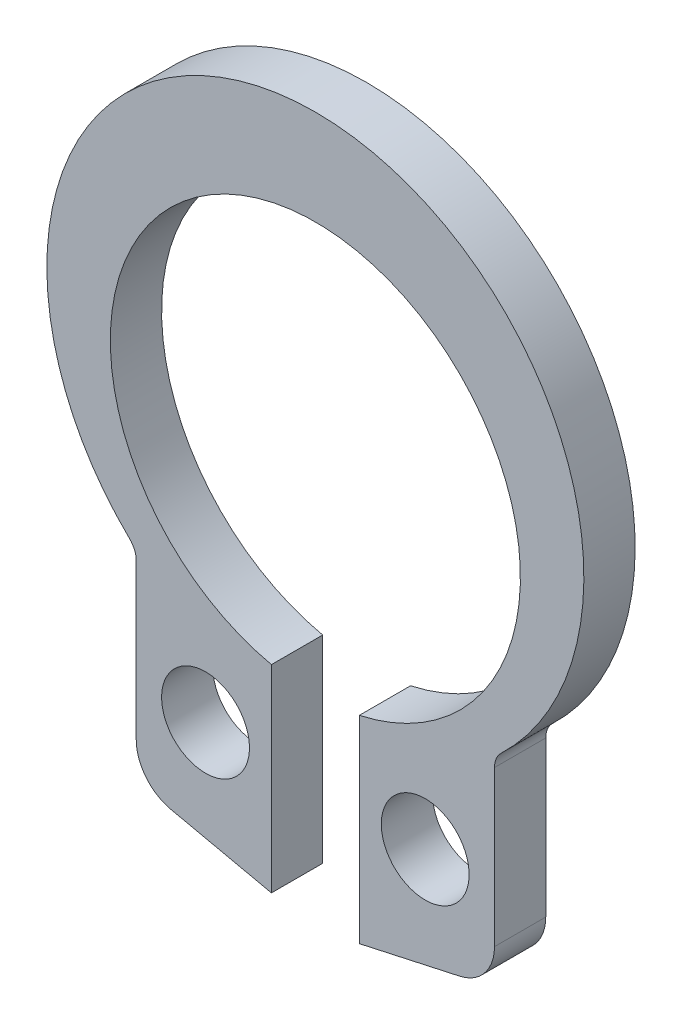
ISO-10303-21;
HEADER;
FILE_DESCRIPTION(('STEP AP214'),'2;1');
FILE_NAME('part.step','',(''),(''),'','','');
FILE_SCHEMA(('AUTOMOTIVE_DESIGN { 1 0 10303 214 1 1 1 1 }'));
ENDSEC;
DATA;
#1=APPLICATION_CONTEXT('core data for automotive mechanical design processes');
#2=APPLICATION_PROTOCOL_DEFINITION('international standard','automotive_design',2000,#1);
#3=PRODUCT_CONTEXT('',#1,'mechanical');
#4=PRODUCT('Part','Part','',(#3));
#5=PRODUCT_RELATED_PRODUCT_CATEGORY('part','',(#4));
#6=PRODUCT_DEFINITION_FORMATION('','',#4);
#7=PRODUCT_DEFINITION_CONTEXT('part definition',#1,'design');
#8=PRODUCT_DEFINITION('design','',#6,#7);
#9=PRODUCT_DEFINITION_SHAPE('','',#8);
#10=(LENGTH_UNIT() NAMED_UNIT(*) SI_UNIT(.MILLI.,.METRE.));
#11=(NAMED_UNIT(*) PLANE_ANGLE_UNIT() SI_UNIT($,.RADIAN.));
#12=(NAMED_UNIT(*) SI_UNIT($,.STERADIAN.) SOLID_ANGLE_UNIT());
#13=UNCERTAINTY_MEASURE_WITH_UNIT(LENGTH_MEASURE(1.E-05),#10,'distance_accuracy_value','');
#14=(GEOMETRIC_REPRESENTATION_CONTEXT(3) GLOBAL_UNCERTAINTY_ASSIGNED_CONTEXT((#13)) GLOBAL_UNIT_ASSIGNED_CONTEXT((#10,
#11,#12)) REPRESENTATION_CONTEXT('',''));
#15=CARTESIAN_POINT('',(0.,0.,0.));
#16=DIRECTION('',(0.,0.,1.));
#17=DIRECTION('',(1.,0.,0.));
#18=AXIS2_PLACEMENT_3D('',#15,#16,#17);
#19=CARTESIAN_POINT('',(1.84609723470894,-4.54731906631156,-0.35));
#20=DIRECTION('',(0.,0.,1.));
#21=DIRECTION('',(1.,0.,0.));
#22=AXIS2_PLACEMENT_3D('',#19,#20,#21);
#23=CYLINDRICAL_SURFACE('',#22,0.6);
#24=CARTESIAN_POINT('',(1.84609723470894,-4.54731906631156,-0.35));
#25=DIRECTION('',(0.,0.,-1.));
#26=DIRECTION('',(-1.,0.,0.));
#27=AXIS2_PLACEMENT_3D('',#24,#25,#26);
#28=CIRCLE('',#27,0.6);
#29=CARTESIAN_POINT('',(2.44609723470894,-4.54731906631156,-0.35));
#30=VERTEX_POINT('',#29);
#31=CARTESIAN_POINT('',(1.97466866328037,-5.13338168050488,-0.35));
#32=VERTEX_POINT('',#31);
#33=EDGE_CURVE('E262',#30,#32,#28,.T.);
#34=ORIENTED_EDGE('',*,*,#33,.F.);
#35=DIRECTION('',(0.,0.,-1.));
#36=VECTOR('',#35,1.);
#37=CARTESIAN_POINT('',(2.44609723470894,-4.54731906631156,-0.35));
#38=LINE('',#37,#36);
#39=CARTESIAN_POINT('',(2.44609723470894,-4.54731906631156,0.35));
#40=VERTEX_POINT('',#39);
#41=EDGE_CURVE('E114',#40,#30,#38,.T.);
#42=ORIENTED_EDGE('',*,*,#41,.F.);
#43=CARTESIAN_POINT('',(1.84609723470894,-4.54731906631156,0.35));
#44=DIRECTION('',(0.,0.,1.));
#45=DIRECTION('',(-1.,0.,0.));
#46=AXIS2_PLACEMENT_3D('',#43,#44,#45);
#47=CIRCLE('',#46,0.6);
#48=CARTESIAN_POINT('',(1.97466866328037,-5.13338168050488,0.35));
#49=VERTEX_POINT('',#48);
#50=EDGE_CURVE('E211',#49,#40,#47,.T.);
#51=ORIENTED_EDGE('',*,*,#50,.F.);
#52=DIRECTION('',(0.,0.,1.));
#53=VECTOR('',#52,1.);
#54=CARTESIAN_POINT('',(1.97466866328037,-5.13338168050488,-0.35));
#55=LINE('',#54,#53);
#56=EDGE_CURVE('E10',#32,#49,#55,.T.);
#57=ORIENTED_EDGE('',*,*,#56,.F.);
#58=EDGE_LOOP('',(#34,#42,#51,#57));
#59=FACE_BOUND('',#58,.T.);
#60=ADVANCED_FACE('F15',(#59),#23,.T.);
#61=CARTESIAN_POINT('',(2.74609723470894,-2.42907726299423,0.35));
#62=DIRECTION('',(0.,0.,-1.));
#63=DIRECTION('',(-1.,0.,0.));
#64=AXIS2_PLACEMENT_3D('',#61,#62,#63);
#65=CYLINDRICAL_SURFACE('',#64,0.3);
#66=CARTESIAN_POINT('',(2.74609723470894,-2.42907726299423,-0.35));
#67=DIRECTION('',(0.,0.,1.));
#68=DIRECTION('',(-1.,0.,0.));
#69=AXIS2_PLACEMENT_3D('',#66,#67,#68);
#70=CIRCLE('',#69,0.3);
#71=CARTESIAN_POINT('',(2.53840920855448,-2.21259242797786,-0.35));
#72=VERTEX_POINT('',#71);
#73=CARTESIAN_POINT('',(2.44609723470894,-2.42907726299423,-0.35));
#74=VERTEX_POINT('',#73);
#75=EDGE_CURVE('E224',#72,#74,#70,.T.);
#76=ORIENTED_EDGE('',*,*,#75,.F.);
#77=DIRECTION('',(0.,0.,-1.));
#78=VECTOR('',#77,1.);
#79=CARTESIAN_POINT('',(2.53840920855448,-2.21259242797786,0.35));
#80=LINE('',#79,#78);
#81=CARTESIAN_POINT('',(2.53840920855448,-2.21259242797786,0.35));
#82=VERTEX_POINT('',#81);
#83=EDGE_CURVE('E222',#82,#72,#80,.T.);
#84=ORIENTED_EDGE('',*,*,#83,.F.);
#85=CARTESIAN_POINT('',(2.74609723470894,-2.42907726299423,0.35));
#86=DIRECTION('',(0.,0.,-1.));
#87=DIRECTION('',(-1.,0.,0.));
#88=AXIS2_PLACEMENT_3D('',#85,#86,#87);
#89=CIRCLE('',#88,0.3);
#90=CARTESIAN_POINT('',(2.44609723470894,-2.42907726299423,0.35));
#91=VERTEX_POINT('',#90);
#92=EDGE_CURVE('E246',#91,#82,#89,.T.);
#93=ORIENTED_EDGE('',*,*,#92,.F.);
#94=DIRECTION('',(0.,0.,1.));
#95=VECTOR('',#94,1.);
#96=CARTESIAN_POINT('',(2.44609723470894,-2.42907726299423,-0.35));
#97=LINE('',#96,#95);
#98=EDGE_CURVE('E26',#74,#91,#97,.T.);
#99=ORIENTED_EDGE('',*,*,#98,.F.);
#100=EDGE_LOOP('',(#76,#84,#93,#99));
#101=FACE_BOUND('',#100,.T.);
#102=ADVANCED_FACE('F349',(#101),#65,.F.);
#103=CARTESIAN_POINT('',(1.5,-3.86943148278917,2.5));
#104=DIRECTION('',(0.,0.,-1.));
#105=DIRECTION('',(-1.,0.,0.));
#106=AXIS2_PLACEMENT_3D('',#103,#104,#105);
#107=CYLINDRICAL_SURFACE('',#106,0.6);
#108=CARTESIAN_POINT('',(1.5,-3.86943148278917,0.35));
#109=DIRECTION('',(0.,0.,-1.));
#110=DIRECTION('',(-1.,0.,0.));
#111=AXIS2_PLACEMENT_3D('',#108,#109,#110);
#112=CIRCLE('',#111,0.6);
#113=CARTESIAN_POINT('',(0.9,-3.86943148278917,0.35));
#114=VERTEX_POINT('',#113);
#115=EDGE_CURVE('E179',#114,#114,#112,.T.);
#116=ORIENTED_EDGE('',*,*,#115,.F.);
#117=EDGE_LOOP('',(#116));
#118=FACE_BOUND('',#117,.T.);
#119=CARTESIAN_POINT('',(1.5,-3.86943148278917,-0.35));
#120=DIRECTION('',(0.,0.,-1.));
#121=DIRECTION('',(-1.,0.,0.));
#122=AXIS2_PLACEMENT_3D('',#119,#120,#121);
#123=CIRCLE('',#122,0.6);
#124=CARTESIAN_POINT('',(0.9,-3.86943148278917,-0.35));
#125=VERTEX_POINT('',#124);
#126=EDGE_CURVE('E255',#125,#125,#123,.T.);
#127=ORIENTED_EDGE('',*,*,#126,.T.);
#128=EDGE_LOOP('',(#127));
#129=FACE_BOUND('',#128,.T.);
#130=ADVANCED_FACE('F354',(#118,#129),#107,.F.);
#131=CARTESIAN_POINT('',(2.44609723470894,-5.02995886623547,-0.35));
#132=DIRECTION('',(-0.214285714285713,0.976771023655525,0.));
#133=DIRECTION('',(0.,0.,1.));
#134=AXIS2_PLACEMENT_3D('',#131,#132,#133);
#135=PLANE('',#134);
#136=DIRECTION('',(-0.976771023655525,-0.214285714285713,0.));
#137=VECTOR('',#136,1.);
#138=CARTESIAN_POINT('',(2.44609723470894,-5.02995886623547,-0.35));
#139=LINE('',#138,#137);
#140=CARTESIAN_POINT('',(0.6,-5.43495886623547,-0.35));
#141=VERTEX_POINT('',#140);
#142=EDGE_CURVE('E167',#32,#141,#139,.T.);
#143=ORIENTED_EDGE('',*,*,#142,.F.);
#144=ORIENTED_EDGE('',*,*,#56,.T.);
#145=DIRECTION('',(-0.976771023655525,-0.214285714285713,0.));
#146=VECTOR('',#145,1.);
#147=CARTESIAN_POINT('',(2.44609723470894,-5.02995886623547,0.35));
#148=LINE('',#147,#146);
#149=CARTESIAN_POINT('',(0.6,-5.43495886623547,0.35));
#150=VERTEX_POINT('',#149);
#151=EDGE_CURVE('E216',#49,#150,#148,.T.);
#152=ORIENTED_EDGE('',*,*,#151,.T.);
#153=DIRECTION('',(0.,0.,1.));
#154=VECTOR('',#153,1.);
#155=CARTESIAN_POINT('',(0.6,-5.43495886623547,-0.35));
#156=LINE('',#155,#154);
#157=EDGE_CURVE('E124',#141,#150,#156,.T.);
#158=ORIENTED_EDGE('',*,*,#157,.F.);
#159=EDGE_LOOP('',(#143,#144,#152,#158));
#160=FACE_BOUND('',#159,.T.);
#161=ADVANCED_FACE('F365',(#160),#135,.F.);
#162=CARTESIAN_POINT('',(2.44609723470894,-2.29815943853953,-0.35));
#163=DIRECTION('',(-1.,0.,0.));
#164=DIRECTION('',(0.,0.,1.));
#165=AXIS2_PLACEMENT_3D('',#162,#163,#164);
#166=PLANE('',#165);
#167=DIRECTION('',(0.,-1.,0.));
#168=VECTOR('',#167,1.);
#169=CARTESIAN_POINT('',(2.44609723470894,-2.29815943853953,0.35));
#170=LINE('',#169,#168);
#171=EDGE_CURVE('E215',#91,#40,#170,.T.);
#172=ORIENTED_EDGE('',*,*,#171,.T.);
#173=ORIENTED_EDGE('',*,*,#41,.T.);
#174=DIRECTION('',(0.,-1.,0.));
#175=VECTOR('',#174,1.);
#176=CARTESIAN_POINT('',(2.44609723470894,-2.29815943853953,-0.35));
#177=LINE('',#176,#175);
#178=EDGE_CURVE('E254',#74,#30,#177,.T.);
#179=ORIENTED_EDGE('',*,*,#178,.F.);
#180=ORIENTED_EDGE('',*,*,#98,.T.);
#181=EDGE_LOOP('',(#172,#173,#179,#180));
#182=FACE_BOUND('',#181,.T.);
#183=ADVANCED_FACE('F362',(#182),#166,.F.);
#184=CARTESIAN_POINT('',(-1.84609723470894,-4.54731906631156,-0.35));
#185=DIRECTION('',(0.,0.,1.));
#186=DIRECTION('',(1.,0.,0.));
#187=AXIS2_PLACEMENT_3D('',#184,#185,#186);
#188=CYLINDRICAL_SURFACE('',#187,0.6);
#189=CARTESIAN_POINT('',(-1.84609723470894,-4.54731906631156,-0.35));
#190=DIRECTION('',(0.,0.,-1.));
#191=DIRECTION('',(-1.,0.,0.));
#192=AXIS2_PLACEMENT_3D('',#189,#190,#191);
#193=CIRCLE('',#192,0.6);
#194=CARTESIAN_POINT('',(-1.97466866328037,-5.13338168050488,-0.35));
#195=VERTEX_POINT('',#194);
#196=CARTESIAN_POINT('',(-2.44609723470894,-4.54731906631156,-0.35));
#197=VERTEX_POINT('',#196);
#198=EDGE_CURVE('E195',#195,#197,#193,.T.);
#199=ORIENTED_EDGE('',*,*,#198,.F.);
#200=DIRECTION('',(0.,0.,-1.));
#201=VECTOR('',#200,1.);
#202=CARTESIAN_POINT('',(-1.97466866328037,-5.13338168050488,-0.35));
#203=LINE('',#202,#201);
#204=CARTESIAN_POINT('',(-1.97466866328037,-5.13338168050488,0.35));
#205=VERTEX_POINT('',#204);
#206=EDGE_CURVE('E210',#205,#195,#203,.T.);
#207=ORIENTED_EDGE('',*,*,#206,.F.);
#208=CARTESIAN_POINT('',(-1.84609723470894,-4.54731906631156,0.35));
#209=DIRECTION('',(0.,0.,1.));
#210=DIRECTION('',(-1.,0.,0.));
#211=AXIS2_PLACEMENT_3D('',#208,#209,#210);
#212=CIRCLE('',#211,0.6);
#213=CARTESIAN_POINT('',(-2.44609723470894,-4.54731906631156,0.35));
#214=VERTEX_POINT('',#213);
#215=EDGE_CURVE('E206',#214,#205,#212,.T.);
#216=ORIENTED_EDGE('',*,*,#215,.F.);
#217=DIRECTION('',(0.,0.,1.));
#218=VECTOR('',#217,1.);
#219=CARTESIAN_POINT('',(-2.44609723470894,-4.54731906631156,-0.35));
#220=LINE('',#219,#218);
#221=EDGE_CURVE('E19',#197,#214,#220,.T.);
#222=ORIENTED_EDGE('',*,*,#221,.F.);
#223=EDGE_LOOP('',(#199,#207,#216,#222));
#224=FACE_BOUND('',#223,.T.);
#225=ADVANCED_FACE('F17',(#224),#188,.T.);
#226=CARTESIAN_POINT('',(-2.74609723470894,-2.42907726299423,0.35));
#227=DIRECTION('',(0.,0.,-1.));
#228=DIRECTION('',(-1.,0.,0.));
#229=AXIS2_PLACEMENT_3D('',#226,#227,#228);
#230=CYLINDRICAL_SURFACE('',#229,0.3);
#231=CARTESIAN_POINT('',(-2.74609723470894,-2.42907726299423,-0.35));
#232=DIRECTION('',(0.,0.,1.));
#233=DIRECTION('',(-1.,0.,0.));
#234=AXIS2_PLACEMENT_3D('',#231,#232,#233);
#235=CIRCLE('',#234,0.3);
#236=CARTESIAN_POINT('',(-2.44609723470894,-2.42907726299423,-0.35));
#237=VERTEX_POINT('',#236);
#238=CARTESIAN_POINT('',(-2.53840920855448,-2.21259242797786,-0.35));
#239=VERTEX_POINT('',#238);
#240=EDGE_CURVE('E274',#237,#239,#235,.T.);
#241=ORIENTED_EDGE('',*,*,#240,.F.);
#242=DIRECTION('',(0.,0.,-1.));
#243=VECTOR('',#242,1.);
#244=CARTESIAN_POINT('',(-2.44609723470894,-2.42907726299423,-0.35));
#245=LINE('',#244,#243);
#246=CARTESIAN_POINT('',(-2.44609723470894,-2.42907726299423,0.35));
#247=VERTEX_POINT('',#246);
#248=EDGE_CURVE('E40',#247,#237,#245,.T.);
#249=ORIENTED_EDGE('',*,*,#248,.F.);
#250=CARTESIAN_POINT('',(-2.74609723470894,-2.42907726299423,0.35));
#251=DIRECTION('',(0.,0.,-1.));
#252=DIRECTION('',(-1.,0.,0.));
#253=AXIS2_PLACEMENT_3D('',#250,#251,#252);
#254=CIRCLE('',#253,0.3);
#255=CARTESIAN_POINT('',(-2.53840920855448,-2.21259242797786,0.35));
#256=VERTEX_POINT('',#255);
#257=EDGE_CURVE('E248',#256,#247,#254,.T.);
#258=ORIENTED_EDGE('',*,*,#257,.F.);
#259=DIRECTION('',(0.,0.,1.));
#260=VECTOR('',#259,1.);
#261=CARTESIAN_POINT('',(-2.53840920855448,-2.21259242797786,0.35));
#262=LINE('',#261,#260);
#263=EDGE_CURVE('E221',#239,#256,#262,.T.);
#264=ORIENTED_EDGE('',*,*,#263,.F.);
#265=EDGE_LOOP('',(#241,#249,#258,#264));
#266=FACE_BOUND('',#265,.T.);
#267=ADVANCED_FACE('F374',(#266),#230,.F.);
#268=CARTESIAN_POINT('',(-1.5,-3.86943148278917,2.5));
#269=DIRECTION('',(0.,0.,-1.));
#270=DIRECTION('',(-1.,0.,0.));
#271=AXIS2_PLACEMENT_3D('',#268,#269,#270);
#272=CYLINDRICAL_SURFACE('',#271,0.6);
#273=CARTESIAN_POINT('',(-1.5,-3.86943148278917,0.35));
#274=DIRECTION('',(0.,0.,-1.));
#275=DIRECTION('',(-1.,0.,0.));
#276=AXIS2_PLACEMENT_3D('',#273,#274,#275);
#277=CIRCLE('',#276,0.6);
#278=CARTESIAN_POINT('',(-2.1,-3.86943148278917,0.35));
#279=VERTEX_POINT('',#278);
#280=EDGE_CURVE('E279',#279,#279,#277,.T.);
#281=ORIENTED_EDGE('',*,*,#280,.F.);
#282=EDGE_LOOP('',(#281));
#283=FACE_BOUND('',#282,.T.);
#284=CARTESIAN_POINT('',(-1.5,-3.86943148278917,-0.35));
#285=DIRECTION('',(0.,0.,-1.));
#286=DIRECTION('',(-1.,0.,0.));
#287=AXIS2_PLACEMENT_3D('',#284,#285,#286);
#288=CIRCLE('',#287,0.6);
#289=CARTESIAN_POINT('',(-2.1,-3.86943148278917,-0.35));
#290=VERTEX_POINT('',#289);
#291=EDGE_CURVE('E252',#290,#290,#288,.T.);
#292=ORIENTED_EDGE('',*,*,#291,.T.);
#293=EDGE_LOOP('',(#292));
#294=FACE_BOUND('',#293,.T.);
#295=ADVANCED_FACE('F371',(#283,#294),#272,.F.);
#296=CARTESIAN_POINT('',(-2.44609723470894,-5.02995886623547,-0.35));
#297=DIRECTION('',(1.,0.,0.));
#298=DIRECTION('',(0.,1.,0.));
#299=AXIS2_PLACEMENT_3D('',#296,#297,#298);
#300=PLANE('',#299);
#301=DIRECTION('',(0.,1.,0.));
#302=VECTOR('',#301,1.);
#303=CARTESIAN_POINT('',(-2.44609723470894,-5.02995886623547,-0.35));
#304=LINE('',#303,#302);
#305=EDGE_CURVE('E198',#197,#237,#304,.T.);
#306=ORIENTED_EDGE('',*,*,#305,.F.);
#307=ORIENTED_EDGE('',*,*,#221,.T.);
#308=DIRECTION('',(0.,1.,0.));
#309=VECTOR('',#308,1.);
#310=CARTESIAN_POINT('',(-2.44609723470894,-5.02995886623547,0.35));
#311=LINE('',#310,#309);
#312=EDGE_CURVE('E251',#214,#247,#311,.T.);
#313=ORIENTED_EDGE('',*,*,#312,.T.);
#314=ORIENTED_EDGE('',*,*,#248,.T.);
#315=EDGE_LOOP('',(#306,#307,#313,#314));
#316=FACE_BOUND('',#315,.T.);
#317=ADVANCED_FACE('F305',(#316),#300,.F.);
#318=CARTESIAN_POINT('',(-0.6,-5.43495886623547,-0.35));
#319=DIRECTION('',(0.214285714285713,0.976771023655525,0.));
#320=DIRECTION('',(0.,0.,-1.));
#321=AXIS2_PLACEMENT_3D('',#318,#319,#320);
#322=PLANE('',#321);
#323=DIRECTION('',(-0.976771023655525,0.214285714285713,0.));
#324=VECTOR('',#323,1.);
#325=CARTESIAN_POINT('',(-0.6,-5.43495886623547,0.35));
#326=LINE('',#325,#324);
#327=CARTESIAN_POINT('',(-0.6,-5.43495886623547,0.35));
#328=VERTEX_POINT('',#327);
#329=EDGE_CURVE('E201',#328,#205,#326,.T.);
#330=ORIENTED_EDGE('',*,*,#329,.T.);
#331=ORIENTED_EDGE('',*,*,#206,.T.);
#332=DIRECTION('',(-0.976771023655525,0.214285714285713,0.));
#333=VECTOR('',#332,1.);
#334=CARTESIAN_POINT('',(-0.6,-5.43495886623547,-0.35));
#335=LINE('',#334,#333);
#336=CARTESIAN_POINT('',(-0.6,-5.43495886623547,-0.35));
#337=VERTEX_POINT('',#336);
#338=EDGE_CURVE('E199',#337,#195,#335,.T.);
#339=ORIENTED_EDGE('',*,*,#338,.F.);
#340=DIRECTION('',(0.,0.,1.));
#341=VECTOR('',#340,1.);
#342=CARTESIAN_POINT('',(-0.6,-5.43495886623547,-0.35));
#343=LINE('',#342,#341);
#344=EDGE_CURVE('E207',#337,#328,#343,.T.);
#345=ORIENTED_EDGE('',*,*,#344,.T.);
#346=EDGE_LOOP('',(#330,#331,#339,#345));
#347=FACE_BOUND('',#346,.T.);
#348=ADVANCED_FACE('F334',(#347),#322,.F.);
#349=CARTESIAN_POINT('',(-0.6,-3.23333333333333,2.85));
#350=DIRECTION('',(-1.,0.,0.));
#351=DIRECTION('',(0.,1.,0.));
#352=AXIS2_PLACEMENT_3D('',#349,#350,#351);
#353=PLANE('',#352);
#354=DIRECTION('',(0.,1.,0.));
#355=VECTOR('',#354,1.);
#356=CARTESIAN_POINT('',(-0.6,0.433333333333333,0.35));
#357=LINE('',#356,#355);
#358=CARTESIAN_POINT('',(-0.6,-2.73495886623547,0.35));
#359=VERTEX_POINT('',#358);
#360=EDGE_CURVE('E205',#328,#359,#357,.T.);
#361=ORIENTED_EDGE('',*,*,#360,.F.);
#362=ORIENTED_EDGE('',*,*,#344,.F.);
#363=DIRECTION('',(0.,1.,0.));
#364=VECTOR('',#363,1.);
#365=CARTESIAN_POINT('',(-0.6,0.433333333333333,-0.35));
#366=LINE('',#365,#364);
#367=CARTESIAN_POINT('',(-0.6,-2.73495886623547,-0.35));
#368=VERTEX_POINT('',#367);
#369=EDGE_CURVE('E169',#337,#368,#366,.T.);
#370=ORIENTED_EDGE('',*,*,#369,.T.);
#371=DIRECTION('',(0.,0.,-1.));
#372=VECTOR('',#371,1.);
#373=CARTESIAN_POINT('',(-0.6,-2.73495886623547,0.35));
#374=LINE('',#373,#372);
#375=EDGE_CURVE('E183',#359,#368,#374,.T.);
#376=ORIENTED_EDGE('',*,*,#375,.F.);
#377=EDGE_LOOP('',(#361,#362,#370,#376));
#378=FACE_BOUND('',#377,.T.);
#379=ADVANCED_FACE('F337',(#378),#353,.F.);
#380=CARTESIAN_POINT('',(0.6,0.,2.85));
#381=DIRECTION('',(1.,0.,0.));
#382=DIRECTION('',(0.,1.,0.));
#383=AXIS2_PLACEMENT_3D('',#380,#381,#382);
#384=PLANE('',#383);
#385=DIRECTION('',(0.,0.,1.));
#386=VECTOR('',#385,1.);
#387=CARTESIAN_POINT('',(0.6,-2.73495886623547,0.35));
#388=LINE('',#387,#386);
#389=CARTESIAN_POINT('',(0.6,-2.73495886623547,-0.35));
#390=VERTEX_POINT('',#389);
#391=CARTESIAN_POINT('',(0.6,-2.73495886623547,0.35));
#392=VERTEX_POINT('',#391);
#393=EDGE_CURVE('E172',#390,#392,#388,.T.);
#394=ORIENTED_EDGE('',*,*,#393,.F.);
#395=DIRECTION('',(0.,-1.,0.));
#396=VECTOR('',#395,1.);
#397=CARTESIAN_POINT('',(0.6,0.433333333333333,-0.35));
#398=LINE('',#397,#396);
#399=EDGE_CURVE('E156',#390,#141,#398,.T.);
#400=ORIENTED_EDGE('',*,*,#399,.T.);
#401=ORIENTED_EDGE('',*,*,#157,.T.);
#402=DIRECTION('',(0.,-1.,0.));
#403=VECTOR('',#402,1.);
#404=CARTESIAN_POINT('',(0.6,0.433333333333333,0.35));
#405=LINE('',#404,#403);
#406=EDGE_CURVE('E174',#392,#150,#405,.T.);
#407=ORIENTED_EDGE('',*,*,#406,.F.);
#408=EDGE_LOOP('',(#394,#400,#401,#407));
#409=FACE_BOUND('',#408,.T.);
#410=ADVANCED_FACE('F173',(#409),#384,.F.);
#411=CARTESIAN_POINT('',(0.,0.433333333333333,-0.35));
#412=DIRECTION('',(0.,0.,-1.));
#413=DIRECTION('',(0.,-1.,0.));
#414=AXIS2_PLACEMENT_3D('',#411,#412,#413);
#415=PLANE('',#414);
#416=ORIENTED_EDGE('',*,*,#178,.T.);
#417=ORIENTED_EDGE('',*,*,#33,.T.);
#418=ORIENTED_EDGE('',*,*,#142,.T.);
#419=ORIENTED_EDGE('',*,*,#399,.F.);
#420=CARTESIAN_POINT('',(0.,0.,-0.35));
#421=DIRECTION('',(0.,0.,-1.));
#422=DIRECTION('',(1.,0.,0.));
#423=AXIS2_PLACEMENT_3D('',#420,#421,#422);
#424=CIRCLE('',#423,2.8);
#425=EDGE_CURVE('E163',#368,#390,#424,.T.);
#426=ORIENTED_EDGE('',*,*,#425,.F.);
#427=ORIENTED_EDGE('',*,*,#369,.F.);
#428=ORIENTED_EDGE('',*,*,#338,.T.);
#429=ORIENTED_EDGE('',*,*,#198,.T.);
#430=ORIENTED_EDGE('',*,*,#305,.T.);
#431=ORIENTED_EDGE('',*,*,#240,.T.);
#432=CARTESIAN_POINT('',(0.,0.433333333333333,-0.35));
#433=DIRECTION('',(0.,0.,-1.));
#434=DIRECTION('',(1.,0.,0.));
#435=AXIS2_PLACEMENT_3D('',#432,#433,#434);
#436=CIRCLE('',#435,3.66666666666667);
#437=EDGE_CURVE('E217',#239,#72,#436,.T.);
#438=ORIENTED_EDGE('',*,*,#437,.T.);
#439=ORIENTED_EDGE('',*,*,#75,.T.);
#440=EDGE_LOOP('',(#416,#417,#418,#419,#426,#427,#428,#429,#430,#431,#438,#439));
#441=FACE_BOUND('',#440,.T.);
#442=ORIENTED_EDGE('',*,*,#291,.F.);
#443=EDGE_LOOP('',(#442));
#444=FACE_BOUND('',#443,.T.);
#445=ORIENTED_EDGE('',*,*,#126,.F.);
#446=EDGE_LOOP('',(#445));
#447=FACE_BOUND('',#446,.T.);
#448=ADVANCED_FACE('F159',(#441,#444,#447),#415,.T.);
#449=CARTESIAN_POINT('',(0.,0.433333333333333,0.35));
#450=DIRECTION('',(0.,0.,-1.));
#451=DIRECTION('',(0.,-1.,0.));
#452=AXIS2_PLACEMENT_3D('',#449,#450,#451);
#453=PLANE('',#452);
#454=ORIENTED_EDGE('',*,*,#151,.F.);
#455=ORIENTED_EDGE('',*,*,#50,.T.);
#456=ORIENTED_EDGE('',*,*,#171,.F.);
#457=ORIENTED_EDGE('',*,*,#92,.T.);
#458=CARTESIAN_POINT('',(0.,0.433333333333333,0.35));
#459=DIRECTION('',(0.,0.,-1.));
#460=DIRECTION('',(1.,0.,0.));
#461=AXIS2_PLACEMENT_3D('',#458,#459,#460);
#462=CIRCLE('',#461,3.66666666666667);
#463=EDGE_CURVE('E241',#256,#82,#462,.T.);
#464=ORIENTED_EDGE('',*,*,#463,.F.);
#465=ORIENTED_EDGE('',*,*,#257,.T.);
#466=ORIENTED_EDGE('',*,*,#312,.F.);
#467=ORIENTED_EDGE('',*,*,#215,.T.);
#468=ORIENTED_EDGE('',*,*,#329,.F.);
#469=ORIENTED_EDGE('',*,*,#360,.T.);
#470=CARTESIAN_POINT('',(0.,0.,0.35));
#471=DIRECTION('',(0.,0.,-1.));
#472=DIRECTION('',(1.,0.,0.));
#473=AXIS2_PLACEMENT_3D('',#470,#471,#472);
#474=CIRCLE('',#473,2.8);
#475=EDGE_CURVE('E190',#359,#392,#474,.T.);
#476=ORIENTED_EDGE('',*,*,#475,.T.);
#477=ORIENTED_EDGE('',*,*,#406,.T.);
#478=EDGE_LOOP('',(#454,#455,#456,#457,#464,#465,#466,#467,#468,#469,#476,#477));
#479=FACE_BOUND('',#478,.T.);
#480=ORIENTED_EDGE('',*,*,#280,.T.);
#481=EDGE_LOOP('',(#480));
#482=FACE_BOUND('',#481,.T.);
#483=ORIENTED_EDGE('',*,*,#115,.T.);
#484=EDGE_LOOP('',(#483));
#485=FACE_BOUND('',#484,.T.);
#486=ADVANCED_FACE('F312',(#479,#482,#485),#453,.F.);
#487=CARTESIAN_POINT('',(0.,0.,0.35));
#488=DIRECTION('',(0.,0.,-1.));
#489=DIRECTION('',(-1.,0.,0.));
#490=AXIS2_PLACEMENT_3D('',#487,#488,#489);
#491=CYLINDRICAL_SURFACE('',#490,2.8);
#492=ORIENTED_EDGE('',*,*,#475,.F.);
#493=ORIENTED_EDGE('',*,*,#375,.T.);
#494=ORIENTED_EDGE('',*,*,#425,.T.);
#495=ORIENTED_EDGE('',*,*,#393,.T.);
#496=EDGE_LOOP('',(#492,#493,#494,#495));
#497=FACE_BOUND('',#496,.T.);
#498=ADVANCED_FACE('F181',(#497),#491,.F.);
#499=CARTESIAN_POINT('',(0.,0.433333333333333,0.35));
#500=DIRECTION('',(0.,0.,-1.));
#501=DIRECTION('',(-1.,0.,0.));
#502=AXIS2_PLACEMENT_3D('',#499,#500,#501);
#503=CYLINDRICAL_SURFACE('',#502,3.66666666666667);
#504=ORIENTED_EDGE('',*,*,#463,.T.);
#505=ORIENTED_EDGE('',*,*,#83,.T.);
#506=ORIENTED_EDGE('',*,*,#437,.F.);
#507=ORIENTED_EDGE('',*,*,#263,.T.);
#508=EDGE_LOOP('',(#504,#505,#506,#507));
#509=FACE_BOUND('',#508,.T.);
#510=ADVANCED_FACE('F359',(#509),#503,.T.);
#511=CLOSED_SHELL('',(#60,#102,#130,#161,#183,#225,#267,#295,#317,#348,#379,#410,#448,#486,#498,#510));
#512=MANIFOLD_SOLID_BREP('B1',#511);
#513=ADVANCED_BREP_SHAPE_REPRESENTATION('',(#18,#512),#14);
#514=SHAPE_DEFINITION_REPRESENTATION(#9,#513);
ENDSEC;
END-ISO-10303-21;
